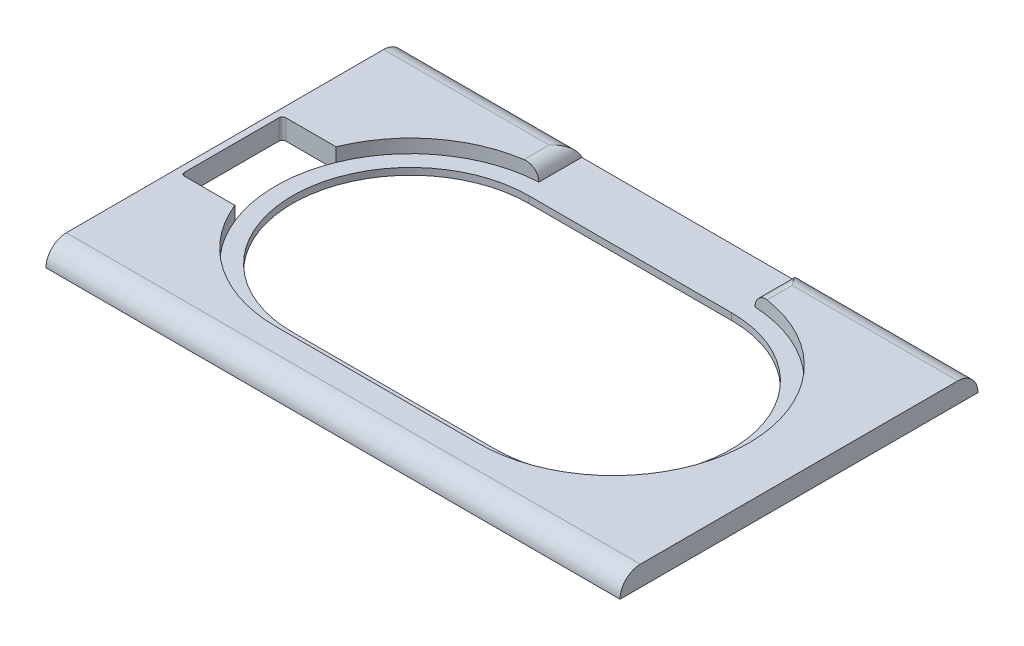
ISO-10303-21;
HEADER;
FILE_DESCRIPTION(('STEP AP214'),'2;1');
FILE_NAME('part.step','',(''),(''),'','','');
FILE_SCHEMA(('AUTOMOTIVE_DESIGN { 1 0 10303 214 1 1 1 1 }'));
ENDSEC;
DATA;
#1=APPLICATION_CONTEXT('core data for automotive mechanical design processes');
#2=APPLICATION_PROTOCOL_DEFINITION('international standard','automotive_design',2000,#1);
#3=PRODUCT_CONTEXT('',#1,'mechanical');
#4=PRODUCT('Part','Part','',(#3));
#5=PRODUCT_RELATED_PRODUCT_CATEGORY('part','',(#4));
#6=PRODUCT_DEFINITION_FORMATION('','',#4);
#7=PRODUCT_DEFINITION_CONTEXT('part definition',#1,'design');
#8=PRODUCT_DEFINITION('design','',#6,#7);
#9=PRODUCT_DEFINITION_SHAPE('','',#8);
#10=(LENGTH_UNIT() NAMED_UNIT(*) SI_UNIT(.MILLI.,.METRE.));
#11=(NAMED_UNIT(*) PLANE_ANGLE_UNIT() SI_UNIT($,.RADIAN.));
#12=(NAMED_UNIT(*) SI_UNIT($,.STERADIAN.) SOLID_ANGLE_UNIT());
#13=UNCERTAINTY_MEASURE_WITH_UNIT(LENGTH_MEASURE(1.E-05),#10,'distance_accuracy_value','');
#14=(GEOMETRIC_REPRESENTATION_CONTEXT(3) GLOBAL_UNCERTAINTY_ASSIGNED_CONTEXT((#13)) GLOBAL_UNIT_ASSIGNED_CONTEXT((#10,
#11,#12)) REPRESENTATION_CONTEXT('',''));
#15=CARTESIAN_POINT('',(0.,0.,0.));
#16=DIRECTION('',(0.,0.,1.));
#17=DIRECTION('',(1.,0.,0.));
#18=AXIS2_PLACEMENT_3D('',#15,#16,#17);
#19=CARTESIAN_POINT('',(55.,2.,53.));
#20=DIRECTION('',(0.,1.,0.));
#21=DIRECTION('',(0.,0.,1.));
#22=AXIS2_PLACEMENT_3D('',#19,#20,#21);
#23=CYLINDRICAL_SURFACE('',#22,40.);
#24=CARTESIAN_POINT('',(49.,5.99999999999999,13.4525601334296));
#25=CARTESIAN_POINT('',(49.112027640321,6.00001193350307,13.4355588484818));
#26=CARTESIAN_POINT('',(49.2241304304167,5.99529409608081,13.4190426615244));
#27=CARTESIAN_POINT('',(49.4476953366035,5.97644662586657,13.3870657271662));
#28=CARTESIAN_POINT('',(49.5591574412833,5.96231682595745,13.3716049985112));
#29=CARTESIAN_POINT('',(49.7805977232871,5.92470137548639,13.3418313209442));
#30=CARTESIAN_POINT('',(49.8905765259213,5.90121980342721,13.3275178749431));
#31=CARTESIAN_POINT('',(50.1083021239497,5.84503633378056,13.3000840779984));
#32=CARTESIAN_POINT('',(50.2160489890054,5.81233472442896,13.2869636897747));
#33=CARTESIAN_POINT('',(50.4285960459482,5.73788730176005,13.2619360441709));
#34=CARTESIAN_POINT('',(50.5333943033812,5.69613570055966,13.2500295703431));
#35=CARTESIAN_POINT('',(50.7392374354071,5.6038561832632,13.2274387594719));
#36=CARTESIAN_POINT('',(50.8402809042007,5.5533250194809,13.216754877117));
#37=CARTESIAN_POINT('',(51.0377550971702,5.44387704835355,13.1966023943002));
#38=CARTESIAN_POINT('',(51.1341889436095,5.38496602767945,13.1871329637146));
#39=CARTESIAN_POINT('',(51.3218348671534,5.25911794226447,13.1693586802414));
#40=CARTESIAN_POINT('',(51.4130450161329,5.19217794178987,13.1610542557519));
#41=CARTESIAN_POINT('',(51.5888552695129,5.05129819524991,13.1456172856768));
#42=CARTESIAN_POINT('',(51.6735002406191,4.97741535825511,13.1384763337562));
#43=CARTESIAN_POINT('',(51.836347309748,4.82272084487885,13.1252212614834));
#44=CARTESIAN_POINT('',(51.9145470033801,4.74190660549532,13.1191075234547));
#45=CARTESIAN_POINT('',(52.0638873818524,4.57394913967928,13.1078346966671));
#46=CARTESIAN_POINT('',(52.1350290757172,4.48680682101455,13.1026754713576));
#47=CARTESIAN_POINT('',(52.2697560193659,4.30680641955266,13.0932295825403));
#48=CARTESIAN_POINT('',(52.3333385719891,4.21394631443655,13.0889432300937));
#49=CARTESIAN_POINT('',(52.5116427693058,3.92834882988197,13.0772960312683));
#50=CARTESIAN_POINT('',(52.6144864901389,3.72795689963627,13.0711061262388));
#51=CARTESIAN_POINT('',(52.7850638340953,3.31287439817628,13.0612792686517));
#52=CARTESIAN_POINT('',(52.8528181150128,3.09819232404183,13.0576408135612));
#53=CARTESIAN_POINT('',(52.9346443395431,2.73517186433829,13.0533435677267));
#54=CARTESIAN_POINT('',(52.9591377493409,2.58911346169711,13.0520921724728));
#55=CARTESIAN_POINT('',(52.9918154464401,2.29538821097221,13.0504409057545));
#56=CARTESIAN_POINT('',(53.0000227135404,2.14772392523537,13.0500398344256));
#57=CARTESIAN_POINT('',(53.,2.,13.0500312891236));
#58=B_SPLINE_CURVE_WITH_KNOTS('',3,(#24,#25,#26,#27,#28,#29,#30,#31,#32,#33,#34,#35,#36,#37,#38,
#39,#40,#41,#42,#43,#44,#45,#46,#47,#48,#49,#50,#51,#52,#53,#54,#55,#56,#57),.UNSPECIFIED.,.F.,
.F.,(4,2,2,2,2,2,2,2,2,2,2,2,2,2,2,2,4),(0.,0.339834175541263,0.67967438527849,1.01936654563377,
1.35904808774443,1.69894751608195,2.03897294683738,2.37876470432848,2.71868108495534,
3.05602069297405,3.39348558020588,3.73090215311095,4.06843875983837,4.74098531301765,
5.41313547437411,5.85658935997375,6.29941708455068),.UNSPECIFIED.);
#59=CARTESIAN_POINT('',(49.,5.99999999999999,13.4525601334296));
#60=VERTEX_POINT('',#59);
#61=CARTESIAN_POINT('',(53.,1.99999999999999,13.0500312891236));
#62=VERTEX_POINT('',#61);
#63=EDGE_CURVE('E273',#60,#62,#58,.T.);
#64=ORIENTED_EDGE('',*,*,#63,.F.);
#65=CARTESIAN_POINT('',(55.,6.,53.));
#66=DIRECTION('',(0.,1.,0.));
#67=DIRECTION('',(0.,0.,1.));
#68=AXIS2_PLACEMENT_3D('',#65,#66,#67);
#69=CIRCLE('',#68,40.);
#70=CARTESIAN_POINT('',(17.9190075645217,6.,38.));
#71=VERTEX_POINT('',#70);
#72=EDGE_CURVE('E327',#60,#71,#69,.T.);
#73=ORIENTED_EDGE('',*,*,#72,.T.);
#74=DIRECTION('',(0.,1.,0.));
#75=VECTOR('',#74,1.);
#76=CARTESIAN_POINT('',(17.9190075645217,0.,38.));
#77=LINE('',#76,#75);
#78=CARTESIAN_POINT('',(17.9190075645217,2.,38.));
#79=VERTEX_POINT('',#78);
#80=EDGE_CURVE('E429',#79,#71,#77,.T.);
#81=ORIENTED_EDGE('',*,*,#80,.F.);
#82=CARTESIAN_POINT('',(55.,2.,53.));
#83=DIRECTION('',(0.,1.,0.));
#84=DIRECTION('',(0.,0.,1.));
#85=AXIS2_PLACEMENT_3D('',#82,#83,#84);
#86=CIRCLE('',#85,40.);
#87=EDGE_CURVE('E329',#62,#79,#86,.T.);
#88=ORIENTED_EDGE('',*,*,#87,.F.);
#89=EDGE_LOOP('',(#64,#73,#81,#88));
#90=FACE_BOUND('',#89,.T.);
#91=ADVANCED_FACE('F36',(#90),#23,.F.);
#92=CARTESIAN_POINT('',(0.,6.,0.));
#93=DIRECTION('',(0.,1.,0.));
#94=DIRECTION('',(0.,0.,1.));
#95=AXIS2_PLACEMENT_3D('',#92,#93,#94);
#96=PLANE('',#95);
#97=ORIENTED_EDGE('',*,*,#72,.F.);
#98=DIRECTION('',(0.,0.,-1.));
#99=VECTOR('',#98,1.);
#100=CARTESIAN_POINT('',(49.,5.99999999999999,25.));
#101=LINE('',#100,#99);
#102=CARTESIAN_POINT('',(49.,5.99999999999999,6.));
#103=VERTEX_POINT('',#102);
#104=EDGE_CURVE('E217',#60,#103,#101,.T.);
#105=ORIENTED_EDGE('',*,*,#104,.T.);
#106=DIRECTION('',(-1.,0.,0.));
#107=VECTOR('',#106,1.);
#108=CARTESIAN_POINT('',(0.,6.,6.));
#109=LINE('',#108,#107);
#110=CARTESIAN_POINT('',(0.,6.,6.));
#111=VERTEX_POINT('',#110);
#112=EDGE_CURVE('E362',#103,#111,#109,.T.);
#113=ORIENTED_EDGE('',*,*,#112,.T.);
#114=DIRECTION('',(0.,0.,1.));
#115=VECTOR('',#114,1.);
#116=CARTESIAN_POINT('',(0.,6.,0.));
#117=LINE('',#116,#115);
#118=CARTESIAN_POINT('',(0.,6.,100.));
#119=VERTEX_POINT('',#118);
#120=EDGE_CURVE('E355',#111,#119,#117,.T.);
#121=ORIENTED_EDGE('',*,*,#120,.T.);
#122=DIRECTION('',(1.,0.,0.));
#123=VECTOR('',#122,1.);
#124=CARTESIAN_POINT('',(170.,6.,100.));
#125=LINE('',#124,#123);
#126=CARTESIAN_POINT('',(170.,6.,100.));
#127=VERTEX_POINT('',#126);
#128=EDGE_CURVE('E375',#119,#127,#125,.T.);
#129=ORIENTED_EDGE('',*,*,#128,.T.);
#130=DIRECTION('',(0.,0.,-1.));
#131=VECTOR('',#130,1.);
#132=CARTESIAN_POINT('',(170.,6.,106.));
#133=LINE('',#132,#131);
#134=CARTESIAN_POINT('',(170.,6.,6.00000000000001));
#135=VERTEX_POINT('',#134);
#136=EDGE_CURVE('E358',#127,#135,#133,.T.);
#137=ORIENTED_EDGE('',*,*,#136,.T.);
#138=CARTESIAN_POINT('',(121.,5.99999999999999,6.));
#139=VERTEX_POINT('',#138);
#140=EDGE_CURVE('E372',#135,#139,#109,.T.);
#141=ORIENTED_EDGE('',*,*,#140,.T.);
#142=DIRECTION('',(0.,0.,-1.));
#143=VECTOR('',#142,1.);
#144=CARTESIAN_POINT('',(121.,5.99999999999999,25.));
#145=LINE('',#144,#143);
#146=CARTESIAN_POINT('',(121.,5.99999999999999,13.4525601334296));
#147=VERTEX_POINT('',#146);
#148=EDGE_CURVE('E223',#147,#139,#145,.T.);
#149=ORIENTED_EDGE('',*,*,#148,.F.);
#150=CARTESIAN_POINT('',(115.,6.,53.));
#151=DIRECTION('',(0.,1.,0.));
#152=DIRECTION('',(0.,0.,1.));
#153=AXIS2_PLACEMENT_3D('',#150,#151,#152);
#154=CIRCLE('',#153,40.);
#155=CARTESIAN_POINT('',(115.,6.,93.));
#156=VERTEX_POINT('',#155);
#157=EDGE_CURVE('E339',#156,#147,#154,.T.);
#158=ORIENTED_EDGE('',*,*,#157,.F.);
#159=DIRECTION('',(1.,0.,0.));
#160=VECTOR('',#159,1.);
#161=CARTESIAN_POINT('',(115.,6.,93.));
#162=LINE('',#161,#160);
#163=CARTESIAN_POINT('',(55.,6.,93.));
#164=VERTEX_POINT('',#163);
#165=EDGE_CURVE('E335',#164,#156,#162,.T.);
#166=ORIENTED_EDGE('',*,*,#165,.F.);
#167=CARTESIAN_POINT('',(17.9190075645217,6.,68.));
#168=VERTEX_POINT('',#167);
#169=EDGE_CURVE('E336',#168,#164,#69,.T.);
#170=ORIENTED_EDGE('',*,*,#169,.F.);
#171=DIRECTION('',(1.,0.,0.));
#172=VECTOR('',#171,1.);
#173=CARTESIAN_POINT('',(2.00000000000003,6.,68.));
#174=LINE('',#173,#172);
#175=CARTESIAN_POINT('',(3.00000000000003,6.,68.));
#176=VERTEX_POINT('',#175);
#177=EDGE_CURVE('E403',#176,#168,#174,.T.);
#178=ORIENTED_EDGE('',*,*,#177,.F.);
#179=CARTESIAN_POINT('',(3.00000000000003,6.,67.));
#180=DIRECTION('',(0.,1.,0.));
#181=DIRECTION('',(0.,0.,1.));
#182=AXIS2_PLACEMENT_3D('',#179,#180,#181);
#183=CIRCLE('',#182,1.);
#184=CARTESIAN_POINT('',(2.00000000000003,6.,67.));
#185=VERTEX_POINT('',#184);
#186=EDGE_CURVE('E44',#176,#185,#183,.F.);
#187=ORIENTED_EDGE('',*,*,#186,.T.);
#188=DIRECTION('',(0.,0.,1.));
#189=VECTOR('',#188,1.);
#190=CARTESIAN_POINT('',(2.00000000000003,6.,53.));
#191=LINE('',#190,#189);
#192=CARTESIAN_POINT('',(2.00000000000003,6.,39.));
#193=VERTEX_POINT('',#192);
#194=EDGE_CURVE('E401',#193,#185,#191,.T.);
#195=ORIENTED_EDGE('',*,*,#194,.F.);
#196=CARTESIAN_POINT('',(3.00000000000003,6.,39.));
#197=DIRECTION('',(0.,1.,0.));
#198=DIRECTION('',(0.,0.,1.));
#199=AXIS2_PLACEMENT_3D('',#196,#197,#198);
#200=CIRCLE('',#199,1.);
#201=CARTESIAN_POINT('',(3.00000000000003,6.,38.));
#202=VERTEX_POINT('',#201);
#203=EDGE_CURVE('E395',#193,#202,#200,.F.);
#204=ORIENTED_EDGE('',*,*,#203,.T.);
#205=DIRECTION('',(-1.,0.,0.));
#206=VECTOR('',#205,1.);
#207=CARTESIAN_POINT('',(2.00000000000003,6.,38.));
#208=LINE('',#207,#206);
#209=EDGE_CURVE('E334',#71,#202,#208,.T.);
#210=ORIENTED_EDGE('',*,*,#209,.F.);
#211=EDGE_LOOP('',(#97,#105,#113,#121,#129,#137,#141,#149,#158,#166,#170,#178,#187,#195,#204,#210));
#212=FACE_BOUND('',#211,.T.);
#213=ADVANCED_FACE('F289',(#212),#96,.T.);
#214=CARTESIAN_POINT('',(0.,0.,6.));
#215=DIRECTION('',(1.,0.,0.));
#216=DIRECTION('',(0.,0.,-1.));
#217=AXIS2_PLACEMENT_3D('',#214,#215,#216);
#218=CYLINDRICAL_SURFACE('',#217,6.);
#219=ORIENTED_EDGE('',*,*,#112,.F.);
#220=CARTESIAN_POINT('',(53.,1.99999999999999,0.343145750507615));
#221=CARTESIAN_POINT('',(53.0000174664337,2.11276685694672,0.382984593548473));
#222=CARTESIAN_POINT('',(52.9952333518893,2.22426108333394,0.426225361286855));
#223=CARTESIAN_POINT('',(52.9768319462175,2.44370227308233,0.518906099376462));
#224=CARTESIAN_POINT('',(52.9632281801996,2.55165440245116,0.568336484333498));
#225=CARTESIAN_POINT('',(52.9281306498674,2.76229257872394,0.672389920918289));
#226=CARTESIAN_POINT('',(52.906717795778,2.86502073790547,0.726955610439092));
#227=CARTESIAN_POINT('',(52.8567647375394,3.06586997853105,0.841144499774636));
#228=CARTESIAN_POINT('',(52.828221175397,3.1639888634389,0.900770073630018));
#229=CARTESIAN_POINT('',(52.7575609837657,3.37696260895209,1.03858262628263));
#230=CARTESIAN_POINT('',(52.7138338199377,3.49054809932149,1.11790677701419));
#231=CARTESIAN_POINT('',(52.6181230754338,3.70982814424492,1.28237541596379));
#232=CARTESIAN_POINT('',(52.566133674548,3.81551705843499,1.36752398284006));
#233=CARTESIAN_POINT('',(52.4549000012219,4.01920409684797,1.54307863833299));
#234=CARTESIAN_POINT('',(52.3956274466333,4.1171696489113,1.6335044578803));
#235=CARTESIAN_POINT('',(52.2710846189315,4.30492829607018,1.81849775292292));
#236=CARTESIAN_POINT('',(52.2058160723557,4.39472372900859,1.91306403209923));
#237=CARTESIAN_POINT('',(52.0439182837522,4.59953447849148,2.14301928308736));
#238=CARTESIAN_POINT('',(51.9449284083707,4.71085958233671,2.28004227115447));
#239=CARTESIAN_POINT('',(51.7391683372935,4.91862033967244,2.55943285667945));
#240=CARTESIAN_POINT('',(51.6323952816737,5.01505047901036,2.70180240931761));
#241=CARTESIAN_POINT('',(51.4126121740892,5.19364501868005,2.99085771924006));
#242=CARTESIAN_POINT('',(51.2995960606419,5.27579522180095,3.13754760434239));
#243=CARTESIAN_POINT('',(51.0687776447926,5.42624261526176,3.43415743925952));
#244=CARTESIAN_POINT('',(50.9509756621649,5.49454072932588,3.58407717295439));
#245=CARTESIAN_POINT('',(50.6862130567376,5.63088381544372,3.91857586851543));
#246=CARTESIAN_POINT('',(50.5383764656806,5.69578986208046,4.10374906523518));
#247=CARTESIAN_POINT('',(50.2389197203938,5.80665146788407,4.47662471613682));
#248=CARTESIAN_POINT('',(50.0872983185352,5.85260068823068,4.66432799470161));
#249=CARTESIAN_POINT('',(49.6294498438285,5.96258866744102,5.22907778470976));
#250=CARTESIAN_POINT('',(49.3193093337325,5.99923030397015,5.60892746208349));
#251=CARTESIAN_POINT('',(49.0065318993191,5.99999599542443,5.99200008750734));
#252=CARTESIAN_POINT('',(49.0032659111905,5.99999999514617,5.99600008967846));
#253=CARTESIAN_POINT('',(49.,6.,6.));
#254=B_SPLINE_CURVE_WITH_KNOTS('',3,(#220,#221,#222,#223,#224,#225,#226,#227,#228,#229,#230,
#231,#232,#233,#234,#235,#236,#237,#238,#239,#240,#241,#242,#243,#244,#245,#246,#247,#248,#249,
#250,#251,#252,#253),.UNSPECIFIED.,.F.,.F.,(4,2,2,2,2,2,2,2,2,2,2,2,2,2,2,2,4),(0.,
0.358544101519818,0.716539665001285,1.07092677298197,1.42548108457668,1.86067793975758,
2.29618273297759,2.7334355632928,3.17056287957943,3.77687559748054,4.38341223864647,
4.99054849594539,5.59764425314425,6.33376954552492,7.07014078579173,8.53825029019912,
8.55374222823159),.UNSPECIFIED.);
#255=CARTESIAN_POINT('',(53.,1.99999999999999,0.343145750507617));
#256=VERTEX_POINT('',#255);
#257=EDGE_CURVE('E267',#103,#256,#254,.F.);
#258=ORIENTED_EDGE('',*,*,#257,.T.);
#259=DIRECTION('',(1.,0.,0.));
#260=VECTOR('',#259,1.);
#261=CARTESIAN_POINT('',(0.,1.99999999999999,0.343145750507616));
#262=LINE('',#261,#260);
#263=CARTESIAN_POINT('',(117.,1.99999999999999,0.343145750507617));
#264=VERTEX_POINT('',#263);
#265=EDGE_CURVE('E280',#256,#264,#262,.T.);
#266=ORIENTED_EDGE('',*,*,#265,.T.);
#267=CARTESIAN_POINT('',(117.,1.99999999999999,0.343145750507614));
#268=CARTESIAN_POINT('',(116.999982533566,2.11276685694671,0.38298459354847));
#269=CARTESIAN_POINT('',(117.004766648111,2.22426108333392,0.426225361286849));
#270=CARTESIAN_POINT('',(117.023168053782,2.44370227308229,0.518906099376448));
#271=CARTESIAN_POINT('',(117.0367718198,2.55165440245112,0.568336484333479));
#272=CARTESIAN_POINT('',(117.071869350133,2.7622925787239,0.672389920918268));
#273=CARTESIAN_POINT('',(117.093282204222,2.86502073790544,0.726955610439074));
#274=CARTESIAN_POINT('',(117.143235262461,3.06586997853104,0.841144499774626));
#275=CARTESIAN_POINT('',(117.171778824603,3.16398886343889,0.900770073630013));
#276=CARTESIAN_POINT('',(117.242439016234,3.3769626089521,1.03858262628263));
#277=CARTESIAN_POINT('',(117.286166180062,3.4905480993215,1.11790677701419));
#278=CARTESIAN_POINT('',(117.381876924566,3.70982814424493,1.2823754159638));
#279=CARTESIAN_POINT('',(117.433866325452,3.815517058435,1.36752398284007));
#280=CARTESIAN_POINT('',(117.545099998778,4.01920409684798,1.543078638333));
#281=CARTESIAN_POINT('',(117.604372553367,4.11716964891131,1.63350445788031));
#282=CARTESIAN_POINT('',(117.728915381069,4.30492829607019,1.81849775292292));
#283=CARTESIAN_POINT('',(117.794183927644,4.39472372900859,1.91306403209923));
#284=CARTESIAN_POINT('',(117.956081716248,4.59953447849147,2.14301928308735));
#285=CARTESIAN_POINT('',(118.055071591629,4.71085958233669,2.28004227115446));
#286=CARTESIAN_POINT('',(118.260831662706,4.91862033967241,2.55943285667942));
#287=CARTESIAN_POINT('',(118.367604718326,5.01505047901033,2.70180240931756));
#288=CARTESIAN_POINT('',(118.587387825911,5.19364501868003,2.99085771924002));
#289=CARTESIAN_POINT('',(118.700403939358,5.27579522180093,3.13754760434237));
#290=CARTESIAN_POINT('',(118.931222355207,5.42624261526175,3.43415743925949));
#291=CARTESIAN_POINT('',(119.049024337835,5.49454072932588,3.58407717295434));
#292=CARTESIAN_POINT('',(119.313786943262,5.63088381544372,3.91857586851547));
#293=CARTESIAN_POINT('',(119.461623534319,5.69578986208045,4.10374906523535));
#294=CARTESIAN_POINT('',(119.761080279606,5.80665146788407,4.47662471613663));
#295=CARTESIAN_POINT('',(119.912701681466,5.85260068823069,4.66432799470092));
#296=CARTESIAN_POINT('',(120.37055015617,5.96258866744102,5.22907778471118));
#297=CARTESIAN_POINT('',(120.680690666258,5.99923030397012,5.60892746209113));
#298=CARTESIAN_POINT('',(120.993468100681,5.99999599542443,5.9920000875075));
#299=CARTESIAN_POINT('',(120.996734088809,5.99999999514617,5.99600008967854));
#300=CARTESIAN_POINT('',(121.,6.,6.));
#301=B_SPLINE_CURVE_WITH_KNOTS('',3,(#267,#268,#269,#270,#271,#272,#273,#274,#275,#276,#277,
#278,#279,#280,#281,#282,#283,#284,#285,#286,#287,#288,#289,#290,#291,#292,#293,#294,#295,#296,
#297,#298,#299,#300),.UNSPECIFIED.,.F.,.F.,(4,2,2,2,2,2,2,2,2,2,2,2,2,2,2,2,4),(0.,
0.358544101519791,0.716539665001234,1.07092677298194,1.42548108457668,1.86067793975759,
2.29618273297761,2.73343556329281,3.17056287957942,3.7768755974805,4.3834122386464,
4.99054849594536,5.59764425314423,6.3337695455249,7.07014078579175,8.53825029019911,
8.55374222823159),.UNSPECIFIED.);
#302=EDGE_CURVE('E239',#264,#139,#301,.T.);
#303=ORIENTED_EDGE('',*,*,#302,.T.);
#304=ORIENTED_EDGE('',*,*,#140,.F.);
#305=CARTESIAN_POINT('',(170.,0.,6.));
#306=DIRECTION('',(-1.,0.,0.));
#307=DIRECTION('',(0.,0.,1.));
#308=AXIS2_PLACEMENT_3D('',#305,#306,#307);
#309=CIRCLE('',#308,6.);
#310=CARTESIAN_POINT('',(170.,0.,0.));
#311=VERTEX_POINT('',#310);
#312=EDGE_CURVE('E378',#311,#135,#309,.F.);
#313=ORIENTED_EDGE('',*,*,#312,.F.);
#314=DIRECTION('',(-1.,0.,0.));
#315=VECTOR('',#314,1.);
#316=CARTESIAN_POINT('',(0.,0.,0.));
#317=LINE('',#316,#315);
#318=CARTESIAN_POINT('',(0.,0.,0.));
#319=VERTEX_POINT('',#318);
#320=EDGE_CURVE('E359',#311,#319,#317,.T.);
#321=ORIENTED_EDGE('',*,*,#320,.T.);
#322=CARTESIAN_POINT('',(0.,0.,6.));
#323=DIRECTION('',(1.,0.,0.));
#324=DIRECTION('',(0.,0.,-1.));
#325=AXIS2_PLACEMENT_3D('',#322,#323,#324);
#326=CIRCLE('',#325,6.);
#327=EDGE_CURVE('E382',#111,#319,#326,.F.);
#328=ORIENTED_EDGE('',*,*,#327,.F.);
#329=EDGE_LOOP('',(#219,#258,#266,#303,#304,#313,#321,#328));
#330=FACE_BOUND('',#329,.T.);
#331=ADVANCED_FACE('F292',(#330),#218,.T.);
#332=CARTESIAN_POINT('',(115.,2.,53.));
#333=DIRECTION('',(0.,1.,0.));
#334=DIRECTION('',(0.,0.,1.));
#335=AXIS2_PLACEMENT_3D('',#332,#333,#334);
#336=CYLINDRICAL_SURFACE('',#335,40.);
#337=CARTESIAN_POINT('',(117.,2.,13.0500312891236));
#338=CARTESIAN_POINT('',(116.999987845602,2.11232991283978,13.050034248323));
#339=CARTESIAN_POINT('',(117.004731243705,2.22465814440537,13.050268259732));
#340=CARTESIAN_POINT('',(117.023641415694,2.44851162987287,13.0512197782962));
#341=CARTESIAN_POINT('',(117.037807759975,2.56003692014771,13.0519372634093));
#342=CARTESIAN_POINT('',(117.075462325312,2.78141425262079,13.0538764071918));
#343=CARTESIAN_POINT('',(117.098943716155,2.89126745971866,13.0550976964753));
#344=CARTESIAN_POINT('',(117.155056036549,3.1086025782936,13.0580855806891));
#345=CARTESIAN_POINT('',(117.187686849485,3.21608451997563,13.059852168669));
#346=CARTESIAN_POINT('',(117.261876696075,3.42794826140853,13.0639850275729));
#347=CARTESIAN_POINT('',(117.30343857034,3.53232906276082,13.0663514893355));
#348=CARTESIAN_POINT('',(117.395201765629,3.73724997100888,13.0717503426765));
#349=CARTESIAN_POINT('',(117.445406273647,3.83778864433746,13.0747829800232));
#350=CARTESIAN_POINT('',(117.554051370222,4.03421429004571,13.0815859447932));
#351=CARTESIAN_POINT('',(117.612487408935,4.13010379308311,13.0853558651396));
#352=CARTESIAN_POINT('',(117.73721590166,4.31664265175703,13.093715334895));
#353=CARTESIAN_POINT('',(117.803511238562,4.40729006627643,13.0983051853797));
#354=CARTESIAN_POINT('',(117.943396376737,4.58258324271321,13.108380227057));
#355=CARTESIAN_POINT('',(118.016979547592,4.6672343419093,13.1138646072989));
#356=CARTESIAN_POINT('',(118.170980553988,4.83005519225214,13.1258122377438));
#357=CARTESIAN_POINT('',(118.251400920316,4.9082225220969,13.1322758511079));
#358=CARTESIAN_POINT('',(118.418455677643,5.05747704435093,13.1462526812261));
#359=CARTESIAN_POINT('',(118.505088675452,5.12856581564925,13.1537656630139));
#360=CARTESIAN_POINT('',(118.683948555837,5.2631974193718,13.1699031984047));
#361=CARTESIAN_POINT('',(118.77617742134,5.32673755302204,13.1785281472717));
#362=CARTESIAN_POINT('',(119.060195001062,5.50528864020593,13.2061458304043));
#363=CARTESIAN_POINT('',(119.259492573718,5.60838877639127,13.2268958153099));
#364=CARTESIAN_POINT('',(119.671880589899,5.77967790703366,13.2732263634701));
#365=CARTESIAN_POINT('',(119.884965252029,5.84788142931585,13.2988049104628));
#366=CARTESIAN_POINT('',(120.249364477728,5.93185601558957,13.3456645494863));
#367=CARTESIAN_POINT('',(120.398652114997,5.95741829287388,13.3657058752564));
#368=CARTESIAN_POINT('',(120.698656855188,5.9914903628316,13.4077219857776));
#369=CARTESIAN_POINT('',(120.849371421627,6.00002618536663,13.4296937654926));
#370=CARTESIAN_POINT('',(121.,5.99999999999999,13.4525601334296));
#371=B_SPLINE_CURVE_WITH_KNOTS('',3,(#337,#338,#339,#340,#341,#342,#343,#344,#345,#346,#347,
#348,#349,#350,#351,#352,#353,#354,#355,#356,#357,#358,#359,#360,#361,#362,#363,#364,#365,#366,
#367,#368,#369,#370),.UNSPECIFIED.,.F.,.F.,(4,2,2,2,2,2,2,2,2,2,2,2,2,2,2,2,4),(0.,
0.336887028247851,0.673758698392529,1.01038381417654,1.34700463958146,1.68373268936035,
2.02058517557722,2.35725219745159,2.69404309739401,3.0305303539045,3.36714270789431,
3.70367981072616,4.04033687184473,4.71294402859269,5.385270943649,5.84269240926621,
6.29941403623996),.UNSPECIFIED.);
#372=CARTESIAN_POINT('',(117.,2.,13.0500312891236));
#373=VERTEX_POINT('',#372);
#374=EDGE_CURVE('E231',#373,#147,#371,.T.);
#375=ORIENTED_EDGE('',*,*,#374,.F.);
#376=CARTESIAN_POINT('',(115.,2.,53.));
#377=DIRECTION('',(0.,1.,0.));
#378=DIRECTION('',(0.,0.,1.));
#379=AXIS2_PLACEMENT_3D('',#376,#377,#378);
#380=CIRCLE('',#379,40.);
#381=CARTESIAN_POINT('',(115.,2.,93.));
#382=VERTEX_POINT('',#381);
#383=EDGE_CURVE('E343',#382,#373,#380,.T.);
#384=ORIENTED_EDGE('',*,*,#383,.F.);
#385=DIRECTION('',(0.,1.,0.));
#386=VECTOR('',#385,1.);
#387=CARTESIAN_POINT('',(115.,2.,93.));
#388=LINE('',#387,#386);
#389=EDGE_CURVE('E349',#382,#156,#388,.T.);
#390=ORIENTED_EDGE('',*,*,#389,.T.);
#391=ORIENTED_EDGE('',*,*,#157,.T.);
#392=EDGE_LOOP('',(#375,#384,#390,#391));
#393=FACE_BOUND('',#392,.T.);
#394=ADVANCED_FACE('F246',(#393),#336,.F.);
#395=CARTESIAN_POINT('',(0.,6.,0.));
#396=DIRECTION('',(1.,0.,0.));
#397=DIRECTION('',(0.,0.,-1.));
#398=AXIS2_PLACEMENT_3D('',#395,#396,#397);
#399=PLANE('',#398);
#400=DIRECTION('',(0.,0.,1.));
#401=VECTOR('',#400,1.);
#402=CARTESIAN_POINT('',(0.,0.,0.));
#403=LINE('',#402,#401);
#404=CARTESIAN_POINT('',(0.,0.,106.));
#405=VERTEX_POINT('',#404);
#406=EDGE_CURVE('E351',#319,#405,#403,.T.);
#407=ORIENTED_EDGE('',*,*,#406,.T.);
#408=CARTESIAN_POINT('',(0.,0.,100.));
#409=DIRECTION('',(1.,0.,0.));
#410=DIRECTION('',(0.,0.,-1.));
#411=AXIS2_PLACEMENT_3D('',#408,#409,#410);
#412=CIRCLE('',#411,6.);
#413=EDGE_CURVE('E384',#405,#119,#412,.F.);
#414=ORIENTED_EDGE('',*,*,#413,.T.);
#415=ORIENTED_EDGE('',*,*,#120,.F.);
#416=ORIENTED_EDGE('',*,*,#327,.T.);
#417=EDGE_LOOP('',(#407,#414,#415,#416));
#418=FACE_BOUND('',#417,.T.);
#419=ADVANCED_FACE('F299',(#418),#399,.F.);
#420=CARTESIAN_POINT('',(170.,6.,106.));
#421=DIRECTION('',(-1.,0.,0.));
#422=DIRECTION('',(0.,0.,1.));
#423=AXIS2_PLACEMENT_3D('',#420,#421,#422);
#424=PLANE('',#423);
#425=ORIENTED_EDGE('',*,*,#136,.F.);
#426=CARTESIAN_POINT('',(170.,0.,100.));
#427=DIRECTION('',(-1.,0.,0.));
#428=DIRECTION('',(0.,0.,1.));
#429=AXIS2_PLACEMENT_3D('',#426,#427,#428);
#430=CIRCLE('',#429,6.);
#431=CARTESIAN_POINT('',(170.,0.,106.));
#432=VERTEX_POINT('',#431);
#433=EDGE_CURVE('E380',#127,#432,#430,.F.);
#434=ORIENTED_EDGE('',*,*,#433,.T.);
#435=DIRECTION('',(0.,0.,-1.));
#436=VECTOR('',#435,1.);
#437=CARTESIAN_POINT('',(170.,0.,106.));
#438=LINE('',#437,#436);
#439=EDGE_CURVE('E368',#432,#311,#438,.T.);
#440=ORIENTED_EDGE('',*,*,#439,.T.);
#441=ORIENTED_EDGE('',*,*,#312,.T.);
#442=EDGE_LOOP('',(#425,#434,#440,#441));
#443=FACE_BOUND('',#442,.T.);
#444=ADVANCED_FACE('F296',(#443),#424,.F.);
#445=CARTESIAN_POINT('',(0.,0.,0.));
#446=DIRECTION('',(0.,1.,0.));
#447=DIRECTION('',(0.,0.,1.));
#448=AXIS2_PLACEMENT_3D('',#445,#446,#447);
#449=PLANE('',#448);
#450=DIRECTION('',(1.,0.,0.));
#451=VECTOR('',#450,1.);
#452=CARTESIAN_POINT('',(55.,0.,88.));
#453=LINE('',#452,#451);
#454=CARTESIAN_POINT('',(55.,0.,88.));
#455=VERTEX_POINT('',#454);
#456=CARTESIAN_POINT('',(115.,0.,88.));
#457=VERTEX_POINT('',#456);
#458=EDGE_CURVE('E190',#455,#457,#453,.T.);
#459=ORIENTED_EDGE('',*,*,#458,.T.);
#460=CARTESIAN_POINT('',(115.,0.,53.));
#461=DIRECTION('',(0.,1.,0.));
#462=DIRECTION('',(0.,0.,-1.));
#463=AXIS2_PLACEMENT_3D('',#460,#461,#462);
#464=CIRCLE('',#463,35.);
#465=CARTESIAN_POINT('',(115.,0.,18.));
#466=VERTEX_POINT('',#465);
#467=EDGE_CURVE('E182',#457,#466,#464,.T.);
#468=ORIENTED_EDGE('',*,*,#467,.T.);
#469=DIRECTION('',(-1.,0.,0.));
#470=VECTOR('',#469,1.);
#471=CARTESIAN_POINT('',(55.,0.,18.));
#472=LINE('',#471,#470);
#473=CARTESIAN_POINT('',(55.,0.,18.));
#474=VERTEX_POINT('',#473);
#475=EDGE_CURVE('E194',#466,#474,#472,.T.);
#476=ORIENTED_EDGE('',*,*,#475,.T.);
#477=CARTESIAN_POINT('',(55.,0.,53.));
#478=DIRECTION('',(0.,1.,0.));
#479=DIRECTION('',(0.,0.,1.));
#480=AXIS2_PLACEMENT_3D('',#477,#478,#479);
#481=CIRCLE('',#480,35.);
#482=EDGE_CURVE('E198',#474,#455,#481,.T.);
#483=ORIENTED_EDGE('',*,*,#482,.T.);
#484=EDGE_LOOP('',(#459,#468,#476,#483));
#485=FACE_BOUND('',#484,.T.);
#486=CARTESIAN_POINT('',(55.,0.,53.));
#487=DIRECTION('',(0.,-1.,0.));
#488=DIRECTION('',(0.,0.,1.));
#489=AXIS2_PLACEMENT_3D('',#486,#487,#488);
#490=CIRCLE('',#489,40.);
#491=CARTESIAN_POINT('',(17.9190075645217,0.,68.));
#492=VERTEX_POINT('',#491);
#493=CARTESIAN_POINT('',(17.9190075645217,0.,38.));
#494=VERTEX_POINT('',#493);
#495=EDGE_CURVE('E417',#492,#494,#490,.T.);
#496=ORIENTED_EDGE('',*,*,#495,.T.);
#497=DIRECTION('',(-1.,0.,0.));
#498=VECTOR('',#497,1.);
#499=CARTESIAN_POINT('',(2.00000000000003,0.,38.));
#500=LINE('',#499,#498);
#501=CARTESIAN_POINT('',(3.00000000000003,0.,38.));
#502=VERTEX_POINT('',#501);
#503=EDGE_CURVE('E422',#494,#502,#500,.T.);
#504=ORIENTED_EDGE('',*,*,#503,.T.);
#505=CARTESIAN_POINT('',(3.00000000000003,0.,39.));
#506=DIRECTION('',(0.,1.,0.));
#507=DIRECTION('',(0.,0.,1.));
#508=AXIS2_PLACEMENT_3D('',#505,#506,#507);
#509=CIRCLE('',#508,1.);
#510=CARTESIAN_POINT('',(2.00000000000003,0.,39.));
#511=VERTEX_POINT('',#510);
#512=EDGE_CURVE('E397',#502,#511,#509,.T.);
#513=ORIENTED_EDGE('',*,*,#512,.T.);
#514=DIRECTION('',(0.,0.,1.));
#515=VECTOR('',#514,1.);
#516=CARTESIAN_POINT('',(2.00000000000003,0.,53.));
#517=LINE('',#516,#515);
#518=CARTESIAN_POINT('',(2.00000000000003,0.,67.));
#519=VERTEX_POINT('',#518);
#520=EDGE_CURVE('E418',#511,#519,#517,.T.);
#521=ORIENTED_EDGE('',*,*,#520,.T.);
#522=CARTESIAN_POINT('',(3.00000000000003,0.,67.));
#523=DIRECTION('',(0.,1.,0.));
#524=DIRECTION('',(0.,0.,1.));
#525=AXIS2_PLACEMENT_3D('',#522,#523,#524);
#526=CIRCLE('',#525,1.);
#527=CARTESIAN_POINT('',(3.00000000000003,0.,68.));
#528=VERTEX_POINT('',#527);
#529=EDGE_CURVE('E11',#519,#528,#526,.T.);
#530=ORIENTED_EDGE('',*,*,#529,.T.);
#531=DIRECTION('',(1.,0.,0.));
#532=VECTOR('',#531,1.);
#533=CARTESIAN_POINT('',(2.00000000000003,0.,68.));
#534=LINE('',#533,#532);
#535=EDGE_CURVE('E413',#528,#492,#534,.T.);
#536=ORIENTED_EDGE('',*,*,#535,.T.);
#537=EDGE_LOOP('',(#496,#504,#513,#521,#530,#536));
#538=FACE_BOUND('',#537,.T.);
#539=ORIENTED_EDGE('',*,*,#406,.F.);
#540=ORIENTED_EDGE('',*,*,#320,.F.);
#541=ORIENTED_EDGE('',*,*,#439,.F.);
#542=DIRECTION('',(1.,0.,0.));
#543=VECTOR('',#542,1.);
#544=CARTESIAN_POINT('',(0.,0.,106.));
#545=LINE('',#544,#543);
#546=EDGE_CURVE('E365',#405,#432,#545,.T.);
#547=ORIENTED_EDGE('',*,*,#546,.F.);
#548=EDGE_LOOP('',(#539,#540,#541,#547));
#549=FACE_BOUND('',#548,.T.);
#550=ADVANCED_FACE('F200',(#485,#538,#549),#449,.F.);
#551=CARTESIAN_POINT('',(0.,0.,100.));
#552=DIRECTION('',(-1.,0.,0.));
#553=DIRECTION('',(0.,0.,1.));
#554=AXIS2_PLACEMENT_3D('',#551,#552,#553);
#555=CYLINDRICAL_SURFACE('',#554,6.);
#556=ORIENTED_EDGE('',*,*,#413,.F.);
#557=ORIENTED_EDGE('',*,*,#546,.T.);
#558=ORIENTED_EDGE('',*,*,#433,.F.);
#559=ORIENTED_EDGE('',*,*,#128,.F.);
#560=EDGE_LOOP('',(#556,#557,#558,#559));
#561=FACE_BOUND('',#560,.T.);
#562=ADVANCED_FACE('F287',(#561),#555,.T.);
#563=CARTESIAN_POINT('',(17.9190075645217,2.,68.));
#564=VERTEX_POINT('',#563);
#565=CARTESIAN_POINT('',(55.,2.,93.));
#566=VERTEX_POINT('',#565);
#567=EDGE_CURVE('E348',#564,#566,#86,.T.);
#568=ORIENTED_EDGE('',*,*,#567,.F.);
#569=DIRECTION('',(0.,1.,0.));
#570=VECTOR('',#569,1.);
#571=CARTESIAN_POINT('',(17.9190075645217,0.,68.));
#572=LINE('',#571,#570);
#573=EDGE_CURVE('E420',#564,#168,#572,.T.);
#574=ORIENTED_EDGE('',*,*,#573,.T.);
#575=ORIENTED_EDGE('',*,*,#169,.T.);
#576=DIRECTION('',(0.,1.,0.));
#577=VECTOR('',#576,1.);
#578=CARTESIAN_POINT('',(55.,2.,93.));
#579=LINE('',#578,#577);
#580=EDGE_CURVE('E352',#566,#164,#579,.T.);
#581=ORIENTED_EDGE('',*,*,#580,.F.);
#582=EDGE_LOOP('',(#568,#574,#575,#581));
#583=FACE_BOUND('',#582,.T.);
#584=ADVANCED_FACE('F282',(#583),#23,.F.);
#585=CARTESIAN_POINT('',(115.,2.,93.));
#586=DIRECTION('',(0.,0.,1.));
#587=DIRECTION('',(1.,0.,0.));
#588=AXIS2_PLACEMENT_3D('',#585,#586,#587);
#589=PLANE('',#588);
#590=ORIENTED_EDGE('',*,*,#165,.T.);
#591=ORIENTED_EDGE('',*,*,#389,.F.);
#592=DIRECTION('',(1.,0.,0.));
#593=VECTOR('',#592,1.);
#594=CARTESIAN_POINT('',(115.,2.,93.));
#595=LINE('',#594,#593);
#596=EDGE_CURVE('E431',#566,#382,#595,.T.);
#597=ORIENTED_EDGE('',*,*,#596,.F.);
#598=ORIENTED_EDGE('',*,*,#580,.T.);
#599=EDGE_LOOP('',(#590,#591,#597,#598));
#600=FACE_BOUND('',#599,.T.);
#601=ADVANCED_FACE('F286',(#600),#589,.F.);
#602=CARTESIAN_POINT('',(55.,2.,53.));
#603=DIRECTION('',(0.,1.,0.));
#604=DIRECTION('',(0.,0.,1.));
#605=AXIS2_PLACEMENT_3D('',#602,#603,#604);
#606=PLANE('',#605);
#607=CARTESIAN_POINT('',(115.,2.,53.));
#608=DIRECTION('',(0.,1.,0.));
#609=DIRECTION('',(0.,0.,-1.));
#610=AXIS2_PLACEMENT_3D('',#607,#608,#609);
#611=CIRCLE('',#610,35.);
#612=CARTESIAN_POINT('',(115.,2.,88.));
#613=VERTEX_POINT('',#612);
#614=CARTESIAN_POINT('',(115.,2.,18.));
#615=VERTEX_POINT('',#614);
#616=EDGE_CURVE('E185',#613,#615,#611,.T.);
#617=ORIENTED_EDGE('',*,*,#616,.F.);
#618=DIRECTION('',(1.,0.,0.));
#619=VECTOR('',#618,1.);
#620=CARTESIAN_POINT('',(55.,2.,88.));
#621=LINE('',#620,#619);
#622=CARTESIAN_POINT('',(55.,2.,88.));
#623=VERTEX_POINT('',#622);
#624=EDGE_CURVE('E202',#623,#613,#621,.T.);
#625=ORIENTED_EDGE('',*,*,#624,.F.);
#626=CARTESIAN_POINT('',(55.,2.,53.));
#627=DIRECTION('',(0.,1.,0.));
#628=DIRECTION('',(0.,0.,1.));
#629=AXIS2_PLACEMENT_3D('',#626,#627,#628);
#630=CIRCLE('',#629,35.);
#631=CARTESIAN_POINT('',(55.,2.,18.));
#632=VERTEX_POINT('',#631);
#633=EDGE_CURVE('E205',#632,#623,#630,.T.);
#634=ORIENTED_EDGE('',*,*,#633,.F.);
#635=DIRECTION('',(-1.,0.,0.));
#636=VECTOR('',#635,1.);
#637=CARTESIAN_POINT('',(55.,2.,18.));
#638=LINE('',#637,#636);
#639=EDGE_CURVE('E211',#615,#632,#638,.T.);
#640=ORIENTED_EDGE('',*,*,#639,.F.);
#641=EDGE_LOOP('',(#617,#625,#634,#640));
#642=FACE_BOUND('',#641,.T.);
#643=DIRECTION('',(0.,0.,-1.));
#644=VECTOR('',#643,1.);
#645=CARTESIAN_POINT('',(53.,1.99999999999999,25.));
#646=LINE('',#645,#644);
#647=EDGE_CURVE('E228',#62,#256,#646,.T.);
#648=ORIENTED_EDGE('',*,*,#647,.F.);
#649=ORIENTED_EDGE('',*,*,#87,.T.);
#650=EDGE_CURVE('E432',#79,#564,#86,.T.);
#651=ORIENTED_EDGE('',*,*,#650,.T.);
#652=ORIENTED_EDGE('',*,*,#567,.T.);
#653=ORIENTED_EDGE('',*,*,#596,.T.);
#654=ORIENTED_EDGE('',*,*,#383,.T.);
#655=DIRECTION('',(0.,0.,-1.));
#656=VECTOR('',#655,1.);
#657=CARTESIAN_POINT('',(117.,1.99999999999999,25.));
#658=LINE('',#657,#656);
#659=EDGE_CURVE('E225',#373,#264,#658,.T.);
#660=ORIENTED_EDGE('',*,*,#659,.T.);
#661=ORIENTED_EDGE('',*,*,#265,.F.);
#662=EDGE_LOOP('',(#648,#649,#651,#652,#653,#654,#660,#661));
#663=FACE_BOUND('',#662,.T.);
#664=ADVANCED_FACE('F438',(#642,#663),#606,.T.);
#665=CARTESIAN_POINT('',(2.00000000000003,0.,38.));
#666=DIRECTION('',(0.,0.,-1.));
#667=DIRECTION('',(-1.,0.,0.));
#668=AXIS2_PLACEMENT_3D('',#665,#666,#667);
#669=PLANE('',#668);
#670=ORIENTED_EDGE('',*,*,#209,.T.);
#671=DIRECTION('',(0.,1.,0.));
#672=VECTOR('',#671,1.);
#673=CARTESIAN_POINT('',(3.00000000000003,0.,38.));
#674=LINE('',#673,#672);
#675=EDGE_CURVE('E391',#202,#502,#674,.F.);
#676=ORIENTED_EDGE('',*,*,#675,.T.);
#677=ORIENTED_EDGE('',*,*,#503,.F.);
#678=EDGE_CURVE('E341',#494,#79,#77,.T.);
#679=ORIENTED_EDGE('',*,*,#678,.T.);
#680=ORIENTED_EDGE('',*,*,#80,.T.);
#681=EDGE_LOOP('',(#670,#676,#677,#679,#680));
#682=FACE_BOUND('',#681,.T.);
#683=ADVANCED_FACE('F456',(#682),#669,.F.);
#684=CARTESIAN_POINT('',(55.,0.,53.));
#685=DIRECTION('',(0.,1.,0.));
#686=DIRECTION('',(0.,0.,1.));
#687=AXIS2_PLACEMENT_3D('',#684,#685,#686);
#688=CYLINDRICAL_SURFACE('',#687,40.);
#689=ORIENTED_EDGE('',*,*,#650,.F.);
#690=ORIENTED_EDGE('',*,*,#678,.F.);
#691=ORIENTED_EDGE('',*,*,#495,.F.);
#692=EDGE_CURVE('E414',#492,#564,#572,.T.);
#693=ORIENTED_EDGE('',*,*,#692,.T.);
#694=EDGE_LOOP('',(#689,#690,#691,#693));
#695=FACE_BOUND('',#694,.T.);
#696=ADVANCED_FACE('F264',(#695),#688,.T.);
#697=CARTESIAN_POINT('',(2.00000000000003,0.,68.));
#698=DIRECTION('',(0.,0.,1.));
#699=DIRECTION('',(1.,0.,0.));
#700=AXIS2_PLACEMENT_3D('',#697,#698,#699);
#701=PLANE('',#700);
#702=ORIENTED_EDGE('',*,*,#535,.F.);
#703=DIRECTION('',(0.,1.,0.));
#704=VECTOR('',#703,1.);
#705=CARTESIAN_POINT('',(3.00000000000003,6.,68.));
#706=LINE('',#705,#704);
#707=EDGE_CURVE('E393',#528,#176,#706,.T.);
#708=ORIENTED_EDGE('',*,*,#707,.T.);
#709=ORIENTED_EDGE('',*,*,#177,.T.);
#710=ORIENTED_EDGE('',*,*,#573,.F.);
#711=ORIENTED_EDGE('',*,*,#692,.F.);
#712=EDGE_LOOP('',(#702,#708,#709,#710,#711));
#713=FACE_BOUND('',#712,.T.);
#714=ADVANCED_FACE('F409',(#713),#701,.F.);
#715=CARTESIAN_POINT('',(2.00000000000003,0.,53.));
#716=DIRECTION('',(-1.,0.,0.));
#717=DIRECTION('',(0.,0.,1.));
#718=AXIS2_PLACEMENT_3D('',#715,#716,#717);
#719=PLANE('',#718);
#720=ORIENTED_EDGE('',*,*,#520,.F.);
#721=DIRECTION('',(0.,1.,0.));
#722=VECTOR('',#721,1.);
#723=CARTESIAN_POINT('',(2.00000000000003,6.,39.));
#724=LINE('',#723,#722);
#725=EDGE_CURVE('E388',#511,#193,#724,.T.);
#726=ORIENTED_EDGE('',*,*,#725,.T.);
#727=ORIENTED_EDGE('',*,*,#194,.T.);
#728=DIRECTION('',(0.,1.,0.));
#729=VECTOR('',#728,1.);
#730=CARTESIAN_POINT('',(2.00000000000003,0.,67.));
#731=LINE('',#730,#729);
#732=EDGE_CURVE('E386',#185,#519,#731,.F.);
#733=ORIENTED_EDGE('',*,*,#732,.T.);
#734=EDGE_LOOP('',(#720,#726,#727,#733));
#735=FACE_BOUND('',#734,.T.);
#736=ADVANCED_FACE('F262',(#735),#719,.F.);
#737=CARTESIAN_POINT('',(49.,1.99999999999999,25.));
#738=DIRECTION('',(0.,0.,-1.));
#739=DIRECTION('',(-1.,0.,0.));
#740=AXIS2_PLACEMENT_3D('',#737,#738,#739);
#741=CYLINDRICAL_SURFACE('',#740,4.);
#742=ORIENTED_EDGE('',*,*,#63,.T.);
#743=ORIENTED_EDGE('',*,*,#647,.T.);
#744=ORIENTED_EDGE('',*,*,#257,.F.);
#745=ORIENTED_EDGE('',*,*,#104,.F.);
#746=EDGE_LOOP('',(#742,#743,#744,#745));
#747=FACE_BOUND('',#746,.T.);
#748=ADVANCED_FACE('F255',(#747),#741,.T.);
#749=CARTESIAN_POINT('',(121.,1.99999999999999,25.));
#750=DIRECTION('',(0.,0.,-1.));
#751=DIRECTION('',(-1.,0.,0.));
#752=AXIS2_PLACEMENT_3D('',#749,#750,#751);
#753=CYLINDRICAL_SURFACE('',#752,4.);
#754=ORIENTED_EDGE('',*,*,#659,.F.);
#755=ORIENTED_EDGE('',*,*,#374,.T.);
#756=ORIENTED_EDGE('',*,*,#148,.T.);
#757=ORIENTED_EDGE('',*,*,#302,.F.);
#758=EDGE_LOOP('',(#754,#755,#756,#757));
#759=FACE_BOUND('',#758,.T.);
#760=ADVANCED_FACE('F250',(#759),#753,.T.);
#761=CARTESIAN_POINT('',(115.,0.,53.));
#762=DIRECTION('',(0.,1.,0.));
#763=DIRECTION('',(0.,0.,1.));
#764=AXIS2_PLACEMENT_3D('',#761,#762,#763);
#765=CYLINDRICAL_SURFACE('',#764,35.);
#766=ORIENTED_EDGE('',*,*,#616,.T.);
#767=DIRECTION('',(0.,1.,0.));
#768=VECTOR('',#767,1.);
#769=CARTESIAN_POINT('',(115.,0.,18.));
#770=LINE('',#769,#768);
#771=EDGE_CURVE('E178',#466,#615,#770,.T.);
#772=ORIENTED_EDGE('',*,*,#771,.F.);
#773=ORIENTED_EDGE('',*,*,#467,.F.);
#774=DIRECTION('',(0.,1.,0.));
#775=VECTOR('',#774,1.);
#776=CARTESIAN_POINT('',(115.,0.,88.));
#777=LINE('',#776,#775);
#778=EDGE_CURVE('E215',#457,#613,#777,.T.);
#779=ORIENTED_EDGE('',*,*,#778,.T.);
#780=EDGE_LOOP('',(#766,#772,#773,#779));
#781=FACE_BOUND('',#780,.T.);
#782=ADVANCED_FACE('F180',(#781),#765,.F.);
#783=CARTESIAN_POINT('',(55.,0.,88.));
#784=DIRECTION('',(0.,0.,1.));
#785=DIRECTION('',(1.,0.,0.));
#786=AXIS2_PLACEMENT_3D('',#783,#784,#785);
#787=PLANE('',#786);
#788=ORIENTED_EDGE('',*,*,#624,.T.);
#789=ORIENTED_EDGE('',*,*,#778,.F.);
#790=ORIENTED_EDGE('',*,*,#458,.F.);
#791=DIRECTION('',(0.,1.,0.));
#792=VECTOR('',#791,1.);
#793=CARTESIAN_POINT('',(55.,0.,88.));
#794=LINE('',#793,#792);
#795=EDGE_CURVE('E218',#455,#623,#794,.T.);
#796=ORIENTED_EDGE('',*,*,#795,.T.);
#797=EDGE_LOOP('',(#788,#789,#790,#796));
#798=FACE_BOUND('',#797,.T.);
#799=ADVANCED_FACE('F500',(#798),#787,.F.);
#800=CARTESIAN_POINT('',(55.,0.,53.));
#801=DIRECTION('',(0.,1.,0.));
#802=DIRECTION('',(0.,0.,1.));
#803=AXIS2_PLACEMENT_3D('',#800,#801,#802);
#804=CYLINDRICAL_SURFACE('',#803,35.);
#805=ORIENTED_EDGE('',*,*,#633,.T.);
#806=ORIENTED_EDGE('',*,*,#795,.F.);
#807=ORIENTED_EDGE('',*,*,#482,.F.);
#808=DIRECTION('',(0.,1.,0.));
#809=VECTOR('',#808,1.);
#810=CARTESIAN_POINT('',(55.,0.,18.));
#811=LINE('',#810,#809);
#812=EDGE_CURVE('E189',#474,#632,#811,.T.);
#813=ORIENTED_EDGE('',*,*,#812,.T.);
#814=EDGE_LOOP('',(#805,#806,#807,#813));
#815=FACE_BOUND('',#814,.T.);
#816=ADVANCED_FACE('F317',(#815),#804,.F.);
#817=CARTESIAN_POINT('',(55.,0.,18.));
#818=DIRECTION('',(0.,0.,-1.));
#819=DIRECTION('',(-1.,0.,0.));
#820=AXIS2_PLACEMENT_3D('',#817,#818,#819);
#821=PLANE('',#820);
#822=ORIENTED_EDGE('',*,*,#639,.T.);
#823=ORIENTED_EDGE('',*,*,#812,.F.);
#824=ORIENTED_EDGE('',*,*,#475,.F.);
#825=ORIENTED_EDGE('',*,*,#771,.T.);
#826=EDGE_LOOP('',(#822,#823,#824,#825));
#827=FACE_BOUND('',#826,.T.);
#828=ADVANCED_FACE('F195',(#827),#821,.F.);
#829=CARTESIAN_POINT('',(3.00000000000003,0.,39.));
#830=DIRECTION('',(0.,-1.,0.));
#831=DIRECTION('',(0.,0.,-1.));
#832=AXIS2_PLACEMENT_3D('',#829,#830,#831);
#833=CYLINDRICAL_SURFACE('',#832,1.);
#834=ORIENTED_EDGE('',*,*,#512,.F.);
#835=ORIENTED_EDGE('',*,*,#675,.F.);
#836=ORIENTED_EDGE('',*,*,#203,.F.);
#837=ORIENTED_EDGE('',*,*,#725,.F.);
#838=EDGE_LOOP('',(#834,#835,#836,#837));
#839=FACE_BOUND('',#838,.T.);
#840=ADVANCED_FACE('F309',(#839),#833,.F.);
#841=CARTESIAN_POINT('',(3.00000000000003,0.,67.));
#842=DIRECTION('',(0.,-1.,0.));
#843=DIRECTION('',(0.,0.,-1.));
#844=AXIS2_PLACEMENT_3D('',#841,#842,#843);
#845=CYLINDRICAL_SURFACE('',#844,1.);
#846=ORIENTED_EDGE('',*,*,#529,.F.);
#847=ORIENTED_EDGE('',*,*,#732,.F.);
#848=ORIENTED_EDGE('',*,*,#186,.F.);
#849=ORIENTED_EDGE('',*,*,#707,.F.);
#850=EDGE_LOOP('',(#846,#847,#848,#849));
#851=FACE_BOUND('',#850,.T.);
#852=ADVANCED_FACE('F38',(#851),#845,.F.);
#853=CLOSED_SHELL('',(#91,#213,#331,#394,#419,#444,#550,#562,#584,#601,#664,#683,#696,#714,#736,
#748,#760,#782,#799,#816,#828,#840,#852));
#854=MANIFOLD_SOLID_BREP('B2',#853);
#855=ADVANCED_BREP_SHAPE_REPRESENTATION('',(#18,#854),#14);
#856=SHAPE_DEFINITION_REPRESENTATION(#9,#855);
ENDSEC;
END-ISO-10303-21;
